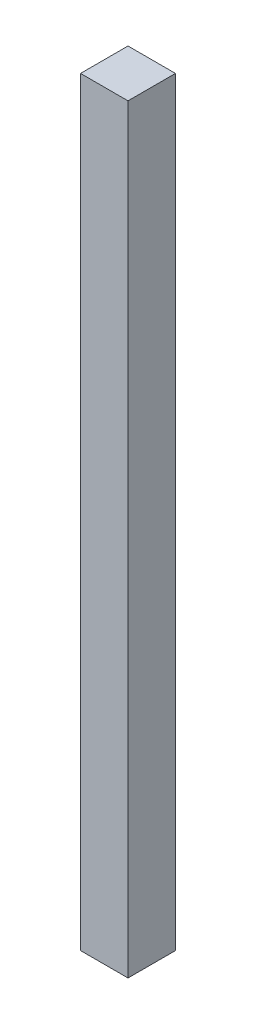
ISO-10303-21;
HEADER;
FILE_DESCRIPTION(('STEP AP214'),'2;1');
FILE_NAME('part.step','',(''),(''),'','','');
FILE_SCHEMA(('AUTOMOTIVE_DESIGN { 1 0 10303 214 1 1 1 1 }'));
ENDSEC;
DATA;
#1=APPLICATION_CONTEXT('core data for automotive mechanical design processes');
#2=APPLICATION_PROTOCOL_DEFINITION('international standard','automotive_design',2000,#1);
#3=PRODUCT_CONTEXT('',#1,'mechanical');
#4=PRODUCT('Part','Part','',(#3));
#5=PRODUCT_RELATED_PRODUCT_CATEGORY('part','',(#4));
#6=PRODUCT_DEFINITION_FORMATION('','',#4);
#7=PRODUCT_DEFINITION_CONTEXT('part definition',#1,'design');
#8=PRODUCT_DEFINITION('design','',#6,#7);
#9=PRODUCT_DEFINITION_SHAPE('','',#8);
#10=(LENGTH_UNIT() NAMED_UNIT(*) SI_UNIT(.MILLI.,.METRE.));
#11=(NAMED_UNIT(*) PLANE_ANGLE_UNIT() SI_UNIT($,.RADIAN.));
#12=(NAMED_UNIT(*) SI_UNIT($,.STERADIAN.) SOLID_ANGLE_UNIT());
#13=UNCERTAINTY_MEASURE_WITH_UNIT(LENGTH_MEASURE(1.E-05),#10,'distance_accuracy_value','');
#14=(GEOMETRIC_REPRESENTATION_CONTEXT(3) GLOBAL_UNCERTAINTY_ASSIGNED_CONTEXT((#13)) GLOBAL_UNIT_ASSIGNED_CONTEXT((#10,
#11,#12)) REPRESENTATION_CONTEXT('',''));
#15=CARTESIAN_POINT('',(0.,0.,0.));
#16=DIRECTION('',(0.,0.,1.));
#17=DIRECTION('',(1.,0.,0.));
#18=AXIS2_PLACEMENT_3D('',#15,#16,#17);
#19=CARTESIAN_POINT('',(0.,800.,0.));
#20=DIRECTION('',(1.,0.,0.));
#21=DIRECTION('',(0.,0.,-1.));
#22=AXIS2_PLACEMENT_3D('',#19,#20,#21);
#23=PLANE('',#22);
#24=DIRECTION('',(0.,0.,1.));
#25=VECTOR('',#24,1.);
#26=CARTESIAN_POINT('',(0.,0.,0.));
#27=LINE('',#26,#25);
#28=CARTESIAN_POINT('',(0.,0.,-50.));
#29=VERTEX_POINT('',#28);
#30=CARTESIAN_POINT('',(0.,0.,0.));
#31=VERTEX_POINT('',#30);
#32=EDGE_CURVE('E96',#29,#31,#27,.T.);
#33=ORIENTED_EDGE('',*,*,#32,.T.);
#34=DIRECTION('',(0.,-1.,0.));
#35=VECTOR('',#34,1.);
#36=CARTESIAN_POINT('',(0.,800.,0.));
#37=LINE('',#36,#35);
#38=CARTESIAN_POINT('',(0.,800.,0.));
#39=VERTEX_POINT('',#38);
#40=EDGE_CURVE('E11',#39,#31,#37,.T.);
#41=ORIENTED_EDGE('',*,*,#40,.F.);
#42=DIRECTION('',(0.,0.,1.));
#43=VECTOR('',#42,1.);
#44=CARTESIAN_POINT('',(0.,800.,0.));
#45=LINE('',#44,#43);
#46=CARTESIAN_POINT('',(0.,800.,-50.));
#47=VERTEX_POINT('',#46);
#48=EDGE_CURVE('E84',#47,#39,#45,.T.);
#49=ORIENTED_EDGE('',*,*,#48,.F.);
#50=DIRECTION('',(0.,-1.,0.));
#51=VECTOR('',#50,1.);
#52=CARTESIAN_POINT('',(0.,800.,-50.));
#53=LINE('',#52,#51);
#54=EDGE_CURVE('E92',#47,#29,#53,.T.);
#55=ORIENTED_EDGE('',*,*,#54,.T.);
#56=EDGE_LOOP('',(#33,#41,#49,#55));
#57=FACE_BOUND('',#56,.T.);
#58=ADVANCED_FACE('F33',(#57),#23,.F.);
#59=CARTESIAN_POINT('',(0.,800.,0.));
#60=DIRECTION('',(0.,0.,-1.));
#61=DIRECTION('',(-1.,0.,0.));
#62=AXIS2_PLACEMENT_3D('',#59,#60,#61);
#63=PLANE('',#62);
#64=DIRECTION('',(1.,0.,0.));
#65=VECTOR('',#64,1.);
#66=CARTESIAN_POINT('',(0.,0.,0.));
#67=LINE('',#66,#65);
#68=CARTESIAN_POINT('',(50.,0.,0.));
#69=VERTEX_POINT('',#68);
#70=EDGE_CURVE('E88',#31,#69,#67,.T.);
#71=ORIENTED_EDGE('',*,*,#70,.T.);
#72=DIRECTION('',(0.,-1.,0.));
#73=VECTOR('',#72,1.);
#74=CARTESIAN_POINT('',(50.,800.,0.));
#75=LINE('',#74,#73);
#76=CARTESIAN_POINT('',(50.,800.,0.));
#77=VERTEX_POINT('',#76);
#78=EDGE_CURVE('E41',#77,#69,#75,.T.);
#79=ORIENTED_EDGE('',*,*,#78,.F.);
#80=DIRECTION('',(1.,0.,0.));
#81=VECTOR('',#80,1.);
#82=CARTESIAN_POINT('',(0.,800.,0.));
#83=LINE('',#82,#81);
#84=EDGE_CURVE('E79',#39,#77,#83,.T.);
#85=ORIENTED_EDGE('',*,*,#84,.F.);
#86=ORIENTED_EDGE('',*,*,#40,.T.);
#87=EDGE_LOOP('',(#71,#79,#85,#86));
#88=FACE_BOUND('',#87,.T.);
#89=ADVANCED_FACE('F87',(#88),#63,.F.);
#90=CARTESIAN_POINT('',(50.,800.,0.));
#91=DIRECTION('',(-1.,0.,0.));
#92=DIRECTION('',(0.,0.,1.));
#93=AXIS2_PLACEMENT_3D('',#90,#91,#92);
#94=PLANE('',#93);
#95=DIRECTION('',(0.,0.,-1.));
#96=VECTOR('',#95,1.);
#97=CARTESIAN_POINT('',(50.,0.,0.));
#98=LINE('',#97,#96);
#99=CARTESIAN_POINT('',(50.,0.,-50.));
#100=VERTEX_POINT('',#99);
#101=EDGE_CURVE('E66',#69,#100,#98,.T.);
#102=ORIENTED_EDGE('',*,*,#101,.T.);
#103=DIRECTION('',(0.,-1.,0.));
#104=VECTOR('',#103,1.);
#105=CARTESIAN_POINT('',(50.,800.,-50.));
#106=LINE('',#105,#104);
#107=CARTESIAN_POINT('',(50.,800.,-50.));
#108=VERTEX_POINT('',#107);
#109=EDGE_CURVE('E89',#108,#100,#106,.T.);
#110=ORIENTED_EDGE('',*,*,#109,.F.);
#111=DIRECTION('',(0.,0.,-1.));
#112=VECTOR('',#111,1.);
#113=CARTESIAN_POINT('',(50.,800.,0.));
#114=LINE('',#113,#112);
#115=EDGE_CURVE('E82',#77,#108,#114,.T.);
#116=ORIENTED_EDGE('',*,*,#115,.F.);
#117=ORIENTED_EDGE('',*,*,#78,.T.);
#118=EDGE_LOOP('',(#102,#110,#116,#117));
#119=FACE_BOUND('',#118,.T.);
#120=ADVANCED_FACE('F90',(#119),#94,.F.);
#121=CARTESIAN_POINT('',(0.,800.,-50.));
#122=DIRECTION('',(0.,0.,1.));
#123=DIRECTION('',(1.,0.,0.));
#124=AXIS2_PLACEMENT_3D('',#121,#122,#123);
#125=PLANE('',#124);
#126=DIRECTION('',(-1.,0.,0.));
#127=VECTOR('',#126,1.);
#128=CARTESIAN_POINT('',(0.,0.,-50.));
#129=LINE('',#128,#127);
#130=EDGE_CURVE('E72',#100,#29,#129,.T.);
#131=ORIENTED_EDGE('',*,*,#130,.T.);
#132=ORIENTED_EDGE('',*,*,#54,.F.);
#133=DIRECTION('',(-1.,0.,0.));
#134=VECTOR('',#133,1.);
#135=CARTESIAN_POINT('',(0.,800.,-50.));
#136=LINE('',#135,#134);
#137=EDGE_CURVE('E49',#108,#47,#136,.T.);
#138=ORIENTED_EDGE('',*,*,#137,.F.);
#139=ORIENTED_EDGE('',*,*,#109,.T.);
#140=EDGE_LOOP('',(#131,#132,#138,#139));
#141=FACE_BOUND('',#140,.T.);
#142=ADVANCED_FACE('F103',(#141),#125,.F.);
#143=CARTESIAN_POINT('',(0.,800.,0.));
#144=DIRECTION('',(0.,-1.,0.));
#145=DIRECTION('',(0.,0.,-1.));
#146=AXIS2_PLACEMENT_3D('',#143,#144,#145);
#147=PLANE('',#146);
#148=ORIENTED_EDGE('',*,*,#48,.T.);
#149=ORIENTED_EDGE('',*,*,#84,.T.);
#150=ORIENTED_EDGE('',*,*,#115,.T.);
#151=ORIENTED_EDGE('',*,*,#137,.T.);
#152=EDGE_LOOP('',(#148,#149,#150,#151));
#153=FACE_BOUND('',#152,.T.);
#154=ADVANCED_FACE('F80',(#153),#147,.F.);
#155=CARTESIAN_POINT('',(0.,0.,0.));
#156=DIRECTION('',(0.,-1.,0.));
#157=DIRECTION('',(0.,0.,-1.));
#158=AXIS2_PLACEMENT_3D('',#155,#156,#157);
#159=PLANE('',#158);
#160=ORIENTED_EDGE('',*,*,#32,.F.);
#161=ORIENTED_EDGE('',*,*,#130,.F.);
#162=ORIENTED_EDGE('',*,*,#101,.F.);
#163=ORIENTED_EDGE('',*,*,#70,.F.);
#164=EDGE_LOOP('',(#160,#161,#162,#163));
#165=FACE_BOUND('',#164,.T.);
#166=ADVANCED_FACE('F106',(#165),#159,.T.);
#167=CLOSED_SHELL('',(#58,#89,#120,#142,#154,#166));
#168=MANIFOLD_SOLID_BREP('B2',#167);
#169=ADVANCED_BREP_SHAPE_REPRESENTATION('',(#18,#168),#14);
#170=SHAPE_DEFINITION_REPRESENTATION(#9,#169);
ENDSEC;
END-ISO-10303-21;
